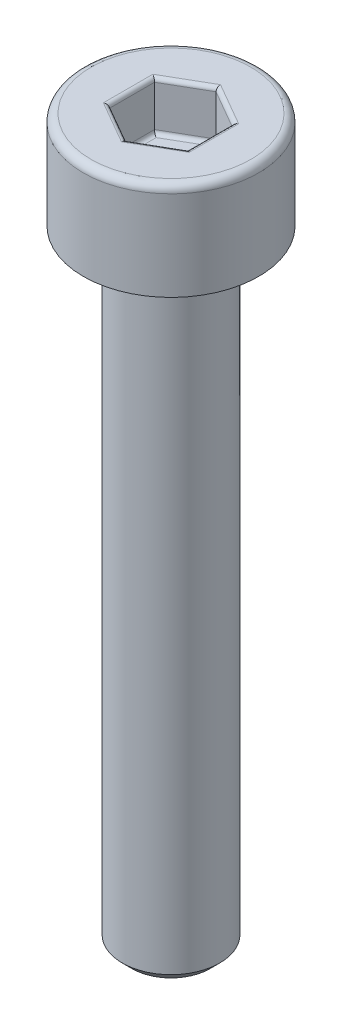
ISO-10303-21;
HEADER;
FILE_DESCRIPTION(('STEP AP214'),'2;1');
FILE_NAME('part.step','',(''),(''),'','','');
FILE_SCHEMA(('AUTOMOTIVE_DESIGN { 1 0 10303 214 1 1 1 1 }'));
ENDSEC;
DATA;
#1=APPLICATION_CONTEXT('core data for automotive mechanical design processes');
#2=APPLICATION_PROTOCOL_DEFINITION('international standard','automotive_design',2000,#1);
#3=PRODUCT_CONTEXT('',#1,'mechanical');
#4=PRODUCT('Part','Part','',(#3));
#5=PRODUCT_RELATED_PRODUCT_CATEGORY('part','',(#4));
#6=PRODUCT_DEFINITION_FORMATION('','',#4);
#7=PRODUCT_DEFINITION_CONTEXT('part definition',#1,'design');
#8=PRODUCT_DEFINITION('design','',#6,#7);
#9=PRODUCT_DEFINITION_SHAPE('','',#8);
#10=(LENGTH_UNIT() NAMED_UNIT(*) SI_UNIT(.MILLI.,.METRE.));
#11=(NAMED_UNIT(*) PLANE_ANGLE_UNIT() SI_UNIT($,.RADIAN.));
#12=(NAMED_UNIT(*) SI_UNIT($,.STERADIAN.) SOLID_ANGLE_UNIT());
#13=UNCERTAINTY_MEASURE_WITH_UNIT(LENGTH_MEASURE(1.E-05),#10,'distance_accuracy_value','');
#14=(GEOMETRIC_REPRESENTATION_CONTEXT(3) GLOBAL_UNCERTAINTY_ASSIGNED_CONTEXT((#13)) GLOBAL_UNIT_ASSIGNED_CONTEXT((#10,
#11,#12)) REPRESENTATION_CONTEXT('',''));
#15=CARTESIAN_POINT('',(0.,0.,0.));
#16=DIRECTION('',(0.,0.,1.));
#17=DIRECTION('',(1.,0.,0.));
#18=AXIS2_PLACEMENT_3D('',#15,#16,#17);
#19=CARTESIAN_POINT('',(0.,-18.5,0.));
#20=DIRECTION('',(0.,-1.,0.));
#21=DIRECTION('',(0.,0.,-1.));
#22=AXIS2_PLACEMENT_3D('',#19,#20,#21);
#23=PLANE('',#22);
#24=CARTESIAN_POINT('',(0.,-18.5,0.));
#25=DIRECTION('',(0.,-1.,0.));
#26=DIRECTION('',(0.,0.,-1.));
#27=AXIS2_PLACEMENT_3D('',#24,#25,#26);
#28=CIRCLE('',#27,0.999999999999999);
#29=CARTESIAN_POINT('',(0.,-18.5,-0.999999999999999));
#30=VERTEX_POINT('',#29);
#31=EDGE_CURVE('E261',#30,#30,#28,.T.);
#32=ORIENTED_EDGE('',*,*,#31,.T.);
#33=EDGE_LOOP('',(#32));
#34=FACE_BOUND('',#33,.T.);
#35=ADVANCED_FACE('F33',(#34),#23,.T.);
#36=CARTESIAN_POINT('',(0.,0.,0.));
#37=DIRECTION('',(0.,1.,0.));
#38=DIRECTION('',(0.,0.,1.));
#39=AXIS2_PLACEMENT_3D('',#36,#37,#38);
#40=CYLINDRICAL_SURFACE('',#39,1.25);
#41=CARTESIAN_POINT('',(0.,-2.75,0.));
#42=DIRECTION('',(0.,-1.,0.));
#43=DIRECTION('',(0.,0.,-1.));
#44=AXIS2_PLACEMENT_3D('',#41,#42,#43);
#45=CIRCLE('',#44,1.25);
#46=CARTESIAN_POINT('',(0.,-2.75,-1.25));
#47=VERTEX_POINT('',#46);
#48=EDGE_CURVE('E258',#47,#47,#45,.T.);
#49=ORIENTED_EDGE('',*,*,#48,.T.);
#50=EDGE_LOOP('',(#49));
#51=FACE_BOUND('',#50,.T.);
#52=CARTESIAN_POINT('',(0.,-18.25,0.));
#53=DIRECTION('',(0.,-1.,0.));
#54=DIRECTION('',(0.,0.,-1.));
#55=AXIS2_PLACEMENT_3D('',#52,#53,#54);
#56=CIRCLE('',#55,1.25);
#57=CARTESIAN_POINT('',(0.,-18.25,-1.25));
#58=VERTEX_POINT('',#57);
#59=EDGE_CURVE('E255',#58,#58,#56,.F.);
#60=ORIENTED_EDGE('',*,*,#59,.T.);
#61=EDGE_LOOP('',(#60));
#62=FACE_BOUND('',#61,.T.);
#63=ADVANCED_FACE('F287',(#51,#62),#40,.T.);
#64=CARTESIAN_POINT('',(-1.25,-2.5,0.));
#65=DIRECTION('',(0.,-1.,0.));
#66=DIRECTION('',(0.,0.,-1.));
#67=AXIS2_PLACEMENT_3D('',#64,#65,#66);
#68=PLANE('',#67);
#69=CARTESIAN_POINT('',(0.,-2.5,0.));
#70=DIRECTION('',(0.,-1.,0.));
#71=DIRECTION('',(0.,0.,-1.));
#72=AXIS2_PLACEMENT_3D('',#69,#70,#71);
#73=CIRCLE('',#72,1.5);
#74=CARTESIAN_POINT('',(0.,-2.5,-1.5));
#75=VERTEX_POINT('',#74);
#76=EDGE_CURVE('E252',#75,#75,#73,.F.);
#77=ORIENTED_EDGE('',*,*,#76,.T.);
#78=EDGE_LOOP('',(#77));
#79=FACE_BOUND('',#78,.T.);
#80=CARTESIAN_POINT('',(0.,-2.5,0.));
#81=DIRECTION('',(0.,1.,0.));
#82=DIRECTION('',(0.,0.,1.));
#83=AXIS2_PLACEMENT_3D('',#80,#81,#82);
#84=CIRCLE('',#83,2.25);
#85=CARTESIAN_POINT('',(0.,-2.5,2.25));
#86=VERTEX_POINT('',#85);
#87=EDGE_CURVE('E249',#86,#86,#84,.T.);
#88=ORIENTED_EDGE('',*,*,#87,.F.);
#89=EDGE_LOOP('',(#88));
#90=FACE_BOUND('',#89,.T.);
#91=ADVANCED_FACE('F293',(#79,#90),#68,.T.);
#92=CARTESIAN_POINT('',(0.,0.,0.));
#93=DIRECTION('',(0.,1.,0.));
#94=DIRECTION('',(0.,0.,1.));
#95=AXIS2_PLACEMENT_3D('',#92,#93,#94);
#96=CYLINDRICAL_SURFACE('',#95,2.25);
#97=CARTESIAN_POINT('',(0.,-0.2,0.));
#98=DIRECTION('',(0.,1.,0.));
#99=DIRECTION('',(0.,0.,1.));
#100=AXIS2_PLACEMENT_3D('',#97,#98,#99);
#101=CIRCLE('',#100,2.25);
#102=CARTESIAN_POINT('',(0.,-0.2,2.25));
#103=VERTEX_POINT('',#102);
#104=EDGE_CURVE('E159',#103,#103,#101,.F.);
#105=ORIENTED_EDGE('',*,*,#104,.T.);
#106=EDGE_LOOP('',(#105));
#107=FACE_BOUND('',#106,.T.);
#108=ORIENTED_EDGE('',*,*,#87,.T.);
#109=EDGE_LOOP('',(#108));
#110=FACE_BOUND('',#109,.T.);
#111=ADVANCED_FACE('F303',(#107,#110),#96,.T.);
#112=CARTESIAN_POINT('',(-2.25,0.,0.));
#113=DIRECTION('',(0.,1.,0.));
#114=DIRECTION('',(0.,0.,1.));
#115=AXIS2_PLACEMENT_3D('',#112,#113,#114);
#116=PLANE('',#115);
#117=DIRECTION('',(0.,0.,1.));
#118=VECTOR('',#117,1.);
#119=CARTESIAN_POINT('',(-1.1,0.,-0.577350269189627));
#120=LINE('',#119,#118);
#121=CARTESIAN_POINT('',(-1.1,0.,0.635085296108588));
#122=VERTEX_POINT('',#121);
#123=CARTESIAN_POINT('',(-1.1,0.,-0.635085296108589));
#124=VERTEX_POINT('',#123);
#125=EDGE_CURVE('E175',#122,#124,#120,.F.);
#126=ORIENTED_EDGE('',*,*,#125,.T.);
#127=DIRECTION('',(-0.866025403784439,0.,0.5));
#128=VECTOR('',#127,1.);
#129=CARTESIAN_POINT('',(-0.0500000000000009,0.,-1.2413030787577));
#130=LINE('',#129,#128);
#131=CARTESIAN_POINT('',(0.,0.,-1.27017059221718));
#132=VERTEX_POINT('',#131);
#133=EDGE_CURVE('E134',#124,#132,#130,.F.);
#134=ORIENTED_EDGE('',*,*,#133,.T.);
#135=DIRECTION('',(-0.866025403784439,0.,-0.5));
#136=VECTOR('',#135,1.);
#137=CARTESIAN_POINT('',(1.05,0.,-0.663952809568071));
#138=LINE('',#137,#136);
#139=CARTESIAN_POINT('',(1.1,0.,-0.63508529610859));
#140=VERTEX_POINT('',#139);
#141=EDGE_CURVE('E161',#132,#140,#138,.F.);
#142=ORIENTED_EDGE('',*,*,#141,.T.);
#143=DIRECTION('',(0.,0.,-1.));
#144=VECTOR('',#143,1.);
#145=CARTESIAN_POINT('',(1.1,0.,0.577350269189625));
#146=LINE('',#145,#144);
#147=CARTESIAN_POINT('',(1.1,0.,0.635085296108588));
#148=VERTEX_POINT('',#147);
#149=EDGE_CURVE('E169',#140,#148,#146,.F.);
#150=ORIENTED_EDGE('',*,*,#149,.T.);
#151=DIRECTION('',(0.866025403784439,0.,-0.5));
#152=VECTOR('',#151,1.);
#153=CARTESIAN_POINT('',(0.0499999999999991,0.,1.24130307875769));
#154=LINE('',#153,#152);
#155=CARTESIAN_POINT('',(0.,0.,1.27017059221718));
#156=VERTEX_POINT('',#155);
#157=EDGE_CURVE('E171',#148,#156,#154,.F.);
#158=ORIENTED_EDGE('',*,*,#157,.T.);
#159=DIRECTION('',(0.866025403784439,0.,0.5));
#160=VECTOR('',#159,1.);
#161=CARTESIAN_POINT('',(-1.05,0.,0.663952809568069));
#162=LINE('',#161,#160);
#163=EDGE_CURVE('E173',#156,#122,#162,.F.);
#164=ORIENTED_EDGE('',*,*,#163,.T.);
#165=EDGE_LOOP('',(#126,#134,#142,#150,#158,#164));
#166=FACE_BOUND('',#165,.T.);
#167=CARTESIAN_POINT('',(0.,0.,0.));
#168=DIRECTION('',(0.,1.,0.));
#169=DIRECTION('',(0.,0.,1.));
#170=AXIS2_PLACEMENT_3D('',#167,#168,#169);
#171=CIRCLE('',#170,2.05);
#172=CARTESIAN_POINT('',(0.,0.,2.05));
#173=VERTEX_POINT('',#172);
#174=EDGE_CURVE('E164',#173,#173,#171,.T.);
#175=ORIENTED_EDGE('',*,*,#174,.T.);
#176=EDGE_LOOP('',(#175));
#177=FACE_BOUND('',#176,.T.);
#178=ADVANCED_FACE('F266',(#166,#177),#116,.T.);
#179=CARTESIAN_POINT('',(0.,-2.5,0.));
#180=DIRECTION('',(0.,1.,0.));
#181=DIRECTION('',(0.,0.,1.));
#182=AXIS2_PLACEMENT_3D('',#179,#180,#181);
#183=CONICAL_SURFACE('',#182,1.5,0.785398163397451);
#184=ORIENTED_EDGE('',*,*,#48,.F.);
#185=EDGE_LOOP('',(#184));
#186=FACE_BOUND('',#185,.T.);
#187=ORIENTED_EDGE('',*,*,#76,.F.);
#188=EDGE_LOOP('',(#187));
#189=FACE_BOUND('',#188,.T.);
#190=ADVANCED_FACE('F281',(#186,#189),#183,.T.);
#191=CARTESIAN_POINT('',(0.,-18.25,0.));
#192=DIRECTION('',(0.,1.,0.));
#193=DIRECTION('',(0.,0.,1.));
#194=AXIS2_PLACEMENT_3D('',#191,#192,#193);
#195=CONICAL_SURFACE('',#194,1.25,0.785398163397441);
#196=ORIENTED_EDGE('',*,*,#31,.F.);
#197=EDGE_LOOP('',(#196));
#198=FACE_BOUND('',#197,.T.);
#199=ORIENTED_EDGE('',*,*,#59,.F.);
#200=EDGE_LOOP('',(#199));
#201=FACE_BOUND('',#200,.T.);
#202=ADVANCED_FACE('F271',(#198,#201),#195,.T.);
#203=CARTESIAN_POINT('',(0.,-0.2,0.));
#204=DIRECTION('',(0.,1.,0.));
#205=DIRECTION('',(0.,0.,1.));
#206=AXIS2_PLACEMENT_3D('',#203,#204,#205);
#207=TOROIDAL_SURFACE('',#206,2.05,0.2);
#208=ORIENTED_EDGE('',*,*,#104,.F.);
#209=EDGE_LOOP('',(#208));
#210=FACE_BOUND('',#209,.T.);
#211=ORIENTED_EDGE('',*,*,#174,.F.);
#212=EDGE_LOOP('',(#211));
#213=FACE_BOUND('',#212,.T.);
#214=ADVANCED_FACE('F268',(#210,#213),#207,.T.);
#215=CARTESIAN_POINT('',(0.999999999999998,-1.25,-0.577350269189627));
#216=DIRECTION('',(0.5,0.,-0.866025403784439));
#217=DIRECTION('',(-0.866025403784439,0.,-0.5));
#218=AXIS2_PLACEMENT_3D('',#215,#216,#217);
#219=PLANE('',#218);
#220=DIRECTION('',(0.,1.,0.));
#221=VECTOR('',#220,1.);
#222=CARTESIAN_POINT('',(0.999999999999998,-1.25,-0.577350269189627));
#223=LINE('',#222,#221);
#224=CARTESIAN_POINT('',(0.999999999999998,-1.15,-0.577350269189627));
#225=VERTEX_POINT('',#224);
#226=CARTESIAN_POINT('',(0.999999999999998,-0.1,-0.577350269189627));
#227=VERTEX_POINT('',#226);
#228=EDGE_CURVE('E243',#225,#227,#223,.T.);
#229=ORIENTED_EDGE('',*,*,#228,.T.);
#230=DIRECTION('',(-0.866025403784439,0.,-0.5));
#231=VECTOR('',#230,1.);
#232=CARTESIAN_POINT('',(0.,-0.1,-1.15470053837925));
#233=LINE('',#232,#231);
#234=CARTESIAN_POINT('',(0.,-0.1,-1.15470053837925));
#235=VERTEX_POINT('',#234);
#236=EDGE_CURVE('E195',#227,#235,#233,.T.);
#237=ORIENTED_EDGE('',*,*,#236,.T.);
#238=DIRECTION('',(0.,1.,0.));
#239=VECTOR('',#238,1.);
#240=CARTESIAN_POINT('',(0.,-1.25,-1.15470053837925));
#241=LINE('',#240,#239);
#242=CARTESIAN_POINT('',(0.,-1.15,-1.15470053837925));
#243=VERTEX_POINT('',#242);
#244=EDGE_CURVE('E145',#243,#235,#241,.T.);
#245=ORIENTED_EDGE('',*,*,#244,.F.);
#246=DIRECTION('',(-0.866025403784439,0.,-0.5));
#247=VECTOR('',#246,1.);
#248=CARTESIAN_POINT('',(0.999999999999998,-1.15,-0.577350269189627));
#249=LINE('',#248,#247);
#250=EDGE_CURVE('E193',#243,#225,#249,.F.);
#251=ORIENTED_EDGE('',*,*,#250,.T.);
#252=EDGE_LOOP('',(#229,#237,#245,#251));
#253=FACE_BOUND('',#252,.T.);
#254=ADVANCED_FACE('F270',(#253),#219,.F.);
#255=CARTESIAN_POINT('',(0.999999999999999,-1.25,0.577350269189625));
#256=DIRECTION('',(1.,0.,0.));
#257=DIRECTION('',(0.,0.,-1.));
#258=AXIS2_PLACEMENT_3D('',#255,#256,#257);
#259=PLANE('',#258);
#260=DIRECTION('',(0.,1.,0.));
#261=VECTOR('',#260,1.);
#262=CARTESIAN_POINT('',(0.999999999999999,-1.25,0.577350269189625));
#263=LINE('',#262,#261);
#264=CARTESIAN_POINT('',(0.999999999999999,-1.15,0.577350269189625));
#265=VERTEX_POINT('',#264);
#266=CARTESIAN_POINT('',(0.999999999999999,-0.1,0.577350269189625));
#267=VERTEX_POINT('',#266);
#268=EDGE_CURVE('E240',#265,#267,#263,.T.);
#269=ORIENTED_EDGE('',*,*,#268,.T.);
#270=DIRECTION('',(0.,0.,-1.));
#271=VECTOR('',#270,1.);
#272=CARTESIAN_POINT('',(0.999999999999998,-0.1,-0.577350269189627));
#273=LINE('',#272,#271);
#274=EDGE_CURVE('E191',#267,#227,#273,.T.);
#275=ORIENTED_EDGE('',*,*,#274,.T.);
#276=ORIENTED_EDGE('',*,*,#228,.F.);
#277=DIRECTION('',(0.,0.,-1.));
#278=VECTOR('',#277,1.);
#279=CARTESIAN_POINT('',(0.999999999999999,-1.15,0.577350269189625));
#280=LINE('',#279,#278);
#281=EDGE_CURVE('E188',#225,#265,#280,.F.);
#282=ORIENTED_EDGE('',*,*,#281,.T.);
#283=EDGE_LOOP('',(#269,#275,#276,#282));
#284=FACE_BOUND('',#283,.T.);
#285=ADVANCED_FACE('F278',(#284),#259,.F.);
#286=CARTESIAN_POINT('',(0.,-1.25,1.15470053837925));
#287=DIRECTION('',(0.5,0.,0.866025403784439));
#288=DIRECTION('',(0.866025403784439,0.,-0.5));
#289=AXIS2_PLACEMENT_3D('',#286,#287,#288);
#290=PLANE('',#289);
#291=DIRECTION('',(0.,1.,0.));
#292=VECTOR('',#291,1.);
#293=CARTESIAN_POINT('',(0.,-1.25,1.15470053837925));
#294=LINE('',#293,#292);
#295=CARTESIAN_POINT('',(0.,-1.15,1.15470053837925));
#296=VERTEX_POINT('',#295);
#297=CARTESIAN_POINT('',(0.,-0.1,1.15470053837925));
#298=VERTEX_POINT('',#297);
#299=EDGE_CURVE('E237',#296,#298,#294,.T.);
#300=ORIENTED_EDGE('',*,*,#299,.T.);
#301=DIRECTION('',(0.866025403784439,0.,-0.5));
#302=VECTOR('',#301,1.);
#303=CARTESIAN_POINT('',(0.999999999999999,-0.1,0.577350269189625));
#304=LINE('',#303,#302);
#305=EDGE_CURVE('E186',#298,#267,#304,.T.);
#306=ORIENTED_EDGE('',*,*,#305,.T.);
#307=ORIENTED_EDGE('',*,*,#268,.F.);
#308=DIRECTION('',(0.866025403784439,0.,-0.5));
#309=VECTOR('',#308,1.);
#310=CARTESIAN_POINT('',(0.,-1.15,1.15470053837925));
#311=LINE('',#310,#309);
#312=EDGE_CURVE('E184',#265,#296,#311,.F.);
#313=ORIENTED_EDGE('',*,*,#312,.T.);
#314=EDGE_LOOP('',(#300,#306,#307,#313));
#315=FACE_BOUND('',#314,.T.);
#316=ADVANCED_FACE('F327',(#315),#290,.F.);
#317=CARTESIAN_POINT('',(-1.,-1.25,0.577350269189625));
#318=DIRECTION('',(-0.5,0.,0.866025403784438));
#319=DIRECTION('',(0.866025403784439,0.,0.5));
#320=AXIS2_PLACEMENT_3D('',#317,#318,#319);
#321=PLANE('',#320);
#322=DIRECTION('',(0.,1.,0.));
#323=VECTOR('',#322,1.);
#324=CARTESIAN_POINT('',(-1.,-1.25,0.577350269189625));
#325=LINE('',#324,#323);
#326=CARTESIAN_POINT('',(-1.,-1.15,0.577350269189625));
#327=VERTEX_POINT('',#326);
#328=CARTESIAN_POINT('',(-1.,-0.1,0.577350269189625));
#329=VERTEX_POINT('',#328);
#330=EDGE_CURVE('E128',#327,#329,#325,.T.);
#331=ORIENTED_EDGE('',*,*,#330,.T.);
#332=DIRECTION('',(0.866025403784439,0.,0.5));
#333=VECTOR('',#332,1.);
#334=CARTESIAN_POINT('',(0.,-0.1,1.15470053837925));
#335=LINE('',#334,#333);
#336=EDGE_CURVE('E182',#329,#298,#335,.T.);
#337=ORIENTED_EDGE('',*,*,#336,.T.);
#338=ORIENTED_EDGE('',*,*,#299,.F.);
#339=DIRECTION('',(0.866025403784439,0.,0.5));
#340=VECTOR('',#339,1.);
#341=CARTESIAN_POINT('',(-1.,-1.15,0.577350269189625));
#342=LINE('',#341,#340);
#343=EDGE_CURVE('E180',#296,#327,#342,.F.);
#344=ORIENTED_EDGE('',*,*,#343,.T.);
#345=EDGE_LOOP('',(#331,#337,#338,#344));
#346=FACE_BOUND('',#345,.T.);
#347=ADVANCED_FACE('F234',(#346),#321,.F.);
#348=CARTESIAN_POINT('',(-1.,-1.25,-0.577350269189627));
#349=DIRECTION('',(-1.,0.,0.));
#350=DIRECTION('',(0.,0.,1.));
#351=AXIS2_PLACEMENT_3D('',#348,#349,#350);
#352=PLANE('',#351);
#353=DIRECTION('',(0.,1.,0.));
#354=VECTOR('',#353,1.);
#355=CARTESIAN_POINT('',(-1.,-1.25,-0.577350269189627));
#356=LINE('',#355,#354);
#357=CARTESIAN_POINT('',(-1.,-1.15,-0.577350269189627));
#358=VERTEX_POINT('',#357);
#359=CARTESIAN_POINT('',(-1.,-0.1,-0.577350269189627));
#360=VERTEX_POINT('',#359);
#361=EDGE_CURVE('E126',#358,#360,#356,.T.);
#362=ORIENTED_EDGE('',*,*,#361,.T.);
#363=DIRECTION('',(0.,0.,1.));
#364=VECTOR('',#363,1.);
#365=CARTESIAN_POINT('',(-1.,-0.1,0.577350269189625));
#366=LINE('',#365,#364);
#367=EDGE_CURVE('E133',#360,#329,#366,.T.);
#368=ORIENTED_EDGE('',*,*,#367,.T.);
#369=ORIENTED_EDGE('',*,*,#330,.F.);
#370=DIRECTION('',(0.,0.,1.));
#371=VECTOR('',#370,1.);
#372=CARTESIAN_POINT('',(-1.,-1.15,-0.577350269189627));
#373=LINE('',#372,#371);
#374=EDGE_CURVE('E123',#327,#358,#373,.F.);
#375=ORIENTED_EDGE('',*,*,#374,.T.);
#376=EDGE_LOOP('',(#362,#368,#369,#375));
#377=FACE_BOUND('',#376,.T.);
#378=ADVANCED_FACE('F125',(#377),#352,.F.);
#379=CARTESIAN_POINT('',(0.,-1.25,-1.15470053837925));
#380=DIRECTION('',(-0.5,0.,-0.866025403784438));
#381=DIRECTION('',(-0.866025403784439,0.,0.5));
#382=AXIS2_PLACEMENT_3D('',#379,#380,#381);
#383=PLANE('',#382);
#384=ORIENTED_EDGE('',*,*,#244,.T.);
#385=DIRECTION('',(-0.866025403784439,0.,0.5));
#386=VECTOR('',#385,1.);
#387=CARTESIAN_POINT('',(-1.,-0.1,-0.577350269189626));
#388=LINE('',#387,#386);
#389=EDGE_CURVE('E144',#235,#360,#388,.T.);
#390=ORIENTED_EDGE('',*,*,#389,.T.);
#391=ORIENTED_EDGE('',*,*,#361,.F.);
#392=DIRECTION('',(-0.866025403784439,0.,0.5));
#393=VECTOR('',#392,1.);
#394=CARTESIAN_POINT('',(0.,-1.15,-1.15470053837925));
#395=LINE('',#394,#393);
#396=EDGE_CURVE('E141',#358,#243,#395,.F.);
#397=ORIENTED_EDGE('',*,*,#396,.T.);
#398=EDGE_LOOP('',(#384,#390,#391,#397));
#399=FACE_BOUND('',#398,.T.);
#400=ADVANCED_FACE('F139',(#399),#383,.F.);
#401=CARTESIAN_POINT('',(0.,-1.25,-1.15470053837925));
#402=DIRECTION('',(0.,1.,0.));
#403=DIRECTION('',(0.,0.,1.));
#404=AXIS2_PLACEMENT_3D('',#401,#402,#403);
#405=PLANE('',#404);
#406=DIRECTION('',(0.866025403784439,0.,-0.5));
#407=VECTOR('',#406,1.);
#408=CARTESIAN_POINT('',(0.949999999999999,-1.25,0.490747728811181));
#409=LINE('',#408,#407);
#410=CARTESIAN_POINT('',(0.,-1.25,1.03923048454133));
#411=VERTEX_POINT('',#410);
#412=CARTESIAN_POINT('',(0.899999999999999,-1.25,0.519615242270663));
#413=VERTEX_POINT('',#412);
#414=EDGE_CURVE('E42',#411,#413,#409,.T.);
#415=ORIENTED_EDGE('',*,*,#414,.T.);
#416=DIRECTION('',(0.,0.,-1.));
#417=VECTOR('',#416,1.);
#418=CARTESIAN_POINT('',(0.899999999999998,-1.25,-1.15470053837925));
#419=LINE('',#418,#417);
#420=CARTESIAN_POINT('',(0.899999999999998,-1.25,-0.519615242270664));
#421=VERTEX_POINT('',#420);
#422=EDGE_CURVE('E11',#413,#421,#419,.T.);
#423=ORIENTED_EDGE('',*,*,#422,.T.);
#424=DIRECTION('',(-0.866025403784439,0.,-0.5));
#425=VECTOR('',#424,1.);
#426=CARTESIAN_POINT('',(-0.0500000000000008,-1.25,-1.06809799800081));
#427=LINE('',#426,#425);
#428=CARTESIAN_POINT('',(0.,-1.25,-1.03923048454133));
#429=VERTEX_POINT('',#428);
#430=EDGE_CURVE('E197',#421,#429,#427,.T.);
#431=ORIENTED_EDGE('',*,*,#430,.T.);
#432=DIRECTION('',(-0.866025403784439,0.,0.5));
#433=VECTOR('',#432,1.);
#434=CARTESIAN_POINT('',(0.0499999999999993,-1.25,-1.06809799800081));
#435=LINE('',#434,#433);
#436=CARTESIAN_POINT('',(-0.9,-1.25,-0.519615242270664));
#437=VERTEX_POINT('',#436);
#438=EDGE_CURVE('E199',#429,#437,#435,.T.);
#439=ORIENTED_EDGE('',*,*,#438,.T.);
#440=DIRECTION('',(0.,0.,1.));
#441=VECTOR('',#440,1.);
#442=CARTESIAN_POINT('',(-0.9,-1.25,-1.15470053837925));
#443=LINE('',#442,#441);
#444=CARTESIAN_POINT('',(-0.9,-1.25,0.519615242270662));
#445=VERTEX_POINT('',#444);
#446=EDGE_CURVE('E150',#437,#445,#443,.T.);
#447=ORIENTED_EDGE('',*,*,#446,.T.);
#448=DIRECTION('',(0.866025403784439,0.,0.5));
#449=VECTOR('',#448,1.);
#450=CARTESIAN_POINT('',(-0.950000000000001,-1.25,0.490747728811181));
#451=LINE('',#450,#449);
#452=EDGE_CURVE('E53',#445,#411,#451,.T.);
#453=ORIENTED_EDGE('',*,*,#452,.T.);
#454=EDGE_LOOP('',(#415,#423,#431,#439,#447,#453));
#455=FACE_BOUND('',#454,.T.);
#456=ADVANCED_FACE('F322',(#455),#405,.T.);
#457=CARTESIAN_POINT('',(0.0499999999999991,-0.1,1.24130307875769));
#458=DIRECTION('',(-0.866025403784439,0.,0.5));
#459=DIRECTION('',(0.5,0.,0.866025403784439));
#460=AXIS2_PLACEMENT_3D('',#457,#458,#459);
#461=CYLINDRICAL_SURFACE('',#460,0.1);
#462=CARTESIAN_POINT('',(0.,-0.1,1.27017059221718));
#463=DIRECTION('',(-1.,0.,0.));
#464=DIRECTION('',(0.,0.,-1.));
#465=AXIS2_PLACEMENT_3D('',#462,#463,#464);
#466=ELLIPSE('',#465,0.115470053837925,0.1);
#467=EDGE_CURVE('E214',#156,#298,#466,.T.);
#468=ORIENTED_EDGE('',*,*,#467,.F.);
#469=ORIENTED_EDGE('',*,*,#157,.F.);
#470=CARTESIAN_POINT('',(1.1,-0.1,0.635085296108588));
#471=DIRECTION('',(-0.5,0.,0.866025403784439));
#472=DIRECTION('',(-0.866025403784439,0.,-0.5));
#473=AXIS2_PLACEMENT_3D('',#470,#471,#472);
#474=ELLIPSE('',#473,0.115470053837925,0.1);
#475=EDGE_CURVE('E217',#267,#148,#474,.F.);
#476=ORIENTED_EDGE('',*,*,#475,.F.);
#477=ORIENTED_EDGE('',*,*,#305,.F.);
#478=EDGE_LOOP('',(#468,#469,#476,#477));
#479=FACE_BOUND('',#478,.T.);
#480=ADVANCED_FACE('F334',(#479),#461,.T.);
#481=CARTESIAN_POINT('',(1.1,-0.1,0.577350269189625));
#482=DIRECTION('',(0.,0.,1.));
#483=DIRECTION('',(1.,0.,0.));
#484=AXIS2_PLACEMENT_3D('',#481,#482,#483);
#485=CYLINDRICAL_SURFACE('',#484,0.1);
#486=ORIENTED_EDGE('',*,*,#475,.T.);
#487=ORIENTED_EDGE('',*,*,#149,.F.);
#488=CARTESIAN_POINT('',(1.1,-0.1,-0.63508529610859));
#489=DIRECTION('',(0.5,0.,0.866025403784439));
#490=DIRECTION('',(-0.866025403784439,0.,0.5));
#491=AXIS2_PLACEMENT_3D('',#488,#489,#490);
#492=ELLIPSE('',#491,0.115470053837925,0.1);
#493=EDGE_CURVE('E211',#227,#140,#492,.F.);
#494=ORIENTED_EDGE('',*,*,#493,.F.);
#495=ORIENTED_EDGE('',*,*,#274,.F.);
#496=EDGE_LOOP('',(#486,#487,#494,#495));
#497=FACE_BOUND('',#496,.T.);
#498=ADVANCED_FACE('F338',(#497),#485,.T.);
#499=CARTESIAN_POINT('',(-1.05,-0.1,0.663952809568069));
#500=DIRECTION('',(-0.866025403784439,0.,-0.5));
#501=DIRECTION('',(-0.5,0.,0.866025403784438));
#502=AXIS2_PLACEMENT_3D('',#499,#500,#501);
#503=CYLINDRICAL_SURFACE('',#502,0.1);
#504=ORIENTED_EDGE('',*,*,#467,.T.);
#505=ORIENTED_EDGE('',*,*,#336,.F.);
#506=CARTESIAN_POINT('',(-1.1,-0.1,0.635085296108587));
#507=DIRECTION('',(-0.5,0.,-0.866025403784439));
#508=DIRECTION('',(0.866025403784439,0.,-0.5));
#509=AXIS2_PLACEMENT_3D('',#506,#507,#508);
#510=ELLIPSE('',#509,0.115470053837925,0.1);
#511=EDGE_CURVE('E208',#122,#329,#510,.T.);
#512=ORIENTED_EDGE('',*,*,#511,.F.);
#513=ORIENTED_EDGE('',*,*,#163,.F.);
#514=EDGE_LOOP('',(#504,#505,#512,#513));
#515=FACE_BOUND('',#514,.T.);
#516=ADVANCED_FACE('F344',(#515),#503,.T.);
#517=CARTESIAN_POINT('',(1.05,-0.1,-0.663952809568071));
#518=DIRECTION('',(0.866025403784439,0.,0.5));
#519=DIRECTION('',(0.5,0.,-0.866025403784439));
#520=AXIS2_PLACEMENT_3D('',#517,#518,#519);
#521=CYLINDRICAL_SURFACE('',#520,0.1);
#522=ORIENTED_EDGE('',*,*,#493,.T.);
#523=ORIENTED_EDGE('',*,*,#141,.F.);
#524=CARTESIAN_POINT('',(0.,-0.1,-1.27017059221718));
#525=DIRECTION('',(1.,0.,0.));
#526=DIRECTION('',(0.,0.,-1.));
#527=AXIS2_PLACEMENT_3D('',#524,#525,#526);
#528=ELLIPSE('',#527,0.115470053837925,0.1);
#529=EDGE_CURVE('E206',#235,#132,#528,.F.);
#530=ORIENTED_EDGE('',*,*,#529,.F.);
#531=ORIENTED_EDGE('',*,*,#236,.F.);
#532=EDGE_LOOP('',(#522,#523,#530,#531));
#533=FACE_BOUND('',#532,.T.);
#534=ADVANCED_FACE('F374',(#533),#521,.T.);
#535=CARTESIAN_POINT('',(-1.1,-0.1,-0.577350269189627));
#536=DIRECTION('',(0.,0.,-1.));
#537=DIRECTION('',(-1.,0.,0.));
#538=AXIS2_PLACEMENT_3D('',#535,#536,#537);
#539=CYLINDRICAL_SURFACE('',#538,0.1);
#540=ORIENTED_EDGE('',*,*,#511,.T.);
#541=ORIENTED_EDGE('',*,*,#367,.F.);
#542=CARTESIAN_POINT('',(-1.1,-0.1,-0.635085296108589));
#543=DIRECTION('',(0.5,0.,-0.866025403784439));
#544=DIRECTION('',(0.866025403784439,0.,0.5));
#545=AXIS2_PLACEMENT_3D('',#542,#543,#544);
#546=ELLIPSE('',#545,0.115470053837925,0.1);
#547=EDGE_CURVE('E204',#124,#360,#546,.T.);
#548=ORIENTED_EDGE('',*,*,#547,.F.);
#549=ORIENTED_EDGE('',*,*,#125,.F.);
#550=EDGE_LOOP('',(#540,#541,#548,#549));
#551=FACE_BOUND('',#550,.T.);
#552=ADVANCED_FACE('F369',(#551),#539,.T.);
#553=CARTESIAN_POINT('',(-0.0500000000000009,-0.1,-1.2413030787577));
#554=DIRECTION('',(0.866025403784439,0.,-0.5));
#555=DIRECTION('',(-0.5,0.,-0.866025403784438));
#556=AXIS2_PLACEMENT_3D('',#553,#554,#555);
#557=CYLINDRICAL_SURFACE('',#556,0.1);
#558=ORIENTED_EDGE('',*,*,#529,.T.);
#559=ORIENTED_EDGE('',*,*,#133,.F.);
#560=ORIENTED_EDGE('',*,*,#547,.T.);
#561=ORIENTED_EDGE('',*,*,#389,.F.);
#562=EDGE_LOOP('',(#558,#559,#560,#561));
#563=FACE_BOUND('',#562,.T.);
#564=ADVANCED_FACE('F365',(#563),#557,.T.);
#565=CARTESIAN_POINT('',(-0.9,-1.15,-1.15470053837925));
#566=DIRECTION('',(0.,0.,1.));
#567=DIRECTION('',(1.,0.,0.));
#568=AXIS2_PLACEMENT_3D('',#565,#566,#567);
#569=CYLINDRICAL_SURFACE('',#568,0.1);
#570=CARTESIAN_POINT('',(-0.900000000000001,-1.15,-0.519615242270664));
#571=DIRECTION('',(-0.5,0.,0.866025403784439));
#572=DIRECTION('',(0.866025403784439,0.,0.5));
#573=AXIS2_PLACEMENT_3D('',#570,#571,#572);
#574=ELLIPSE('',#573,0.115470053837925,0.1);
#575=EDGE_CURVE('E149',#358,#437,#574,.T.);
#576=ORIENTED_EDGE('',*,*,#575,.F.);
#577=ORIENTED_EDGE('',*,*,#374,.F.);
#578=CARTESIAN_POINT('',(-0.9,-1.15,0.519615242270662));
#579=DIRECTION('',(0.5,0.,0.866025403784439));
#580=DIRECTION('',(0.866025403784439,0.,-0.5));
#581=AXIS2_PLACEMENT_3D('',#578,#579,#580);
#582=ELLIPSE('',#581,0.115470053837925,0.1);
#583=EDGE_CURVE('E37',#445,#327,#582,.F.);
#584=ORIENTED_EDGE('',*,*,#583,.F.);
#585=ORIENTED_EDGE('',*,*,#446,.F.);
#586=EDGE_LOOP('',(#576,#577,#584,#585));
#587=FACE_BOUND('',#586,.T.);
#588=ADVANCED_FACE('F35',(#587),#569,.F.);
#589=CARTESIAN_POINT('',(-0.950000000000001,-1.15,0.490747728811181));
#590=DIRECTION('',(0.866025403784439,0.,0.5));
#591=DIRECTION('',(0.5,0.,-0.866025403784438));
#592=AXIS2_PLACEMENT_3D('',#589,#590,#591);
#593=CYLINDRICAL_SURFACE('',#592,0.1);
#594=ORIENTED_EDGE('',*,*,#583,.T.);
#595=ORIENTED_EDGE('',*,*,#343,.F.);
#596=CARTESIAN_POINT('',(0.,-1.15,1.03923048454133));
#597=DIRECTION('',(1.,0.,0.));
#598=DIRECTION('',(0.,0.,-1.));
#599=AXIS2_PLACEMENT_3D('',#596,#597,#598);
#600=ELLIPSE('',#599,0.115470053837925,0.1);
#601=EDGE_CURVE('E153',#411,#296,#600,.F.);
#602=ORIENTED_EDGE('',*,*,#601,.F.);
#603=ORIENTED_EDGE('',*,*,#452,.F.);
#604=EDGE_LOOP('',(#594,#595,#602,#603));
#605=FACE_BOUND('',#604,.T.);
#606=ADVANCED_FACE('F231',(#605),#593,.F.);
#607=CARTESIAN_POINT('',(0.0499999999999993,-1.15,-1.06809799800081));
#608=DIRECTION('',(-0.866025403784439,0.,0.5));
#609=DIRECTION('',(0.5,0.,0.866025403784438));
#610=AXIS2_PLACEMENT_3D('',#607,#608,#609);
#611=CYLINDRICAL_SURFACE('',#610,0.1);
#612=ORIENTED_EDGE('',*,*,#575,.T.);
#613=ORIENTED_EDGE('',*,*,#438,.F.);
#614=CARTESIAN_POINT('',(0.,-1.15,-1.03923048454133));
#615=DIRECTION('',(-1.,0.,0.));
#616=DIRECTION('',(0.,0.,1.));
#617=AXIS2_PLACEMENT_3D('',#614,#615,#616);
#618=ELLIPSE('',#617,0.115470053837925,0.1);
#619=EDGE_CURVE('E157',#243,#429,#618,.T.);
#620=ORIENTED_EDGE('',*,*,#619,.F.);
#621=ORIENTED_EDGE('',*,*,#396,.F.);
#622=EDGE_LOOP('',(#612,#613,#620,#621));
#623=FACE_BOUND('',#622,.T.);
#624=ADVANCED_FACE('F155',(#623),#611,.F.);
#625=CARTESIAN_POINT('',(0.949999999999999,-1.15,0.490747728811181));
#626=DIRECTION('',(0.866025403784439,0.,-0.5));
#627=DIRECTION('',(-0.5,0.,-0.866025403784439));
#628=AXIS2_PLACEMENT_3D('',#625,#626,#627);
#629=CYLINDRICAL_SURFACE('',#628,0.1);
#630=ORIENTED_EDGE('',*,*,#601,.T.);
#631=ORIENTED_EDGE('',*,*,#312,.F.);
#632=CARTESIAN_POINT('',(0.899999999999999,-1.15,0.519615242270662));
#633=DIRECTION('',(0.5,0.,-0.866025403784439));
#634=DIRECTION('',(-0.866025403784439,0.,-0.5));
#635=AXIS2_PLACEMENT_3D('',#632,#633,#634);
#636=ELLIPSE('',#635,0.115470053837925,0.1);
#637=EDGE_CURVE('E222',#413,#265,#636,.F.);
#638=ORIENTED_EDGE('',*,*,#637,.F.);
#639=ORIENTED_EDGE('',*,*,#414,.F.);
#640=EDGE_LOOP('',(#630,#631,#638,#639));
#641=FACE_BOUND('',#640,.T.);
#642=ADVANCED_FACE('F228',(#641),#629,.F.);
#643=CARTESIAN_POINT('',(-0.0500000000000008,-1.15,-1.06809799800081));
#644=DIRECTION('',(-0.866025403784439,0.,-0.5));
#645=DIRECTION('',(-0.5,0.,0.866025403784439));
#646=AXIS2_PLACEMENT_3D('',#643,#644,#645);
#647=CYLINDRICAL_SURFACE('',#646,0.1);
#648=ORIENTED_EDGE('',*,*,#619,.T.);
#649=ORIENTED_EDGE('',*,*,#430,.F.);
#650=CARTESIAN_POINT('',(0.899999999999998,-1.15,-0.519615242270664));
#651=DIRECTION('',(-0.5,0.,-0.866025403784439));
#652=DIRECTION('',(0.866025403784439,0.,-0.5));
#653=AXIS2_PLACEMENT_3D('',#650,#651,#652);
#654=ELLIPSE('',#653,0.115470053837925,0.1);
#655=EDGE_CURVE('E220',#225,#421,#654,.T.);
#656=ORIENTED_EDGE('',*,*,#655,.F.);
#657=ORIENTED_EDGE('',*,*,#250,.F.);
#658=EDGE_LOOP('',(#648,#649,#656,#657));
#659=FACE_BOUND('',#658,.T.);
#660=ADVANCED_FACE('F353',(#659),#647,.F.);
#661=CARTESIAN_POINT('',(0.899999999999998,-1.15,-1.15470053837925));
#662=DIRECTION('',(0.,0.,-1.));
#663=DIRECTION('',(-1.,0.,0.));
#664=AXIS2_PLACEMENT_3D('',#661,#662,#663);
#665=CYLINDRICAL_SURFACE('',#664,0.1);
#666=ORIENTED_EDGE('',*,*,#637,.T.);
#667=ORIENTED_EDGE('',*,*,#281,.F.);
#668=ORIENTED_EDGE('',*,*,#655,.T.);
#669=ORIENTED_EDGE('',*,*,#422,.F.);
#670=EDGE_LOOP('',(#666,#667,#668,#669));
#671=FACE_BOUND('',#670,.T.);
#672=ADVANCED_FACE('F350',(#671),#665,.F.);
#673=CLOSED_SHELL('',(#35,#63,#91,#111,#178,#190,#202,#214,#254,#285,#316,#347,#378,#400,#456,
#480,#498,#516,#534,#552,#564,#588,#606,#624,#642,#660,#672));
#674=MANIFOLD_SOLID_BREP('B2',#673);
#675=ADVANCED_BREP_SHAPE_REPRESENTATION('',(#18,#674),#14);
#676=SHAPE_DEFINITION_REPRESENTATION(#9,#675);
ENDSEC;
END-ISO-10303-21;
